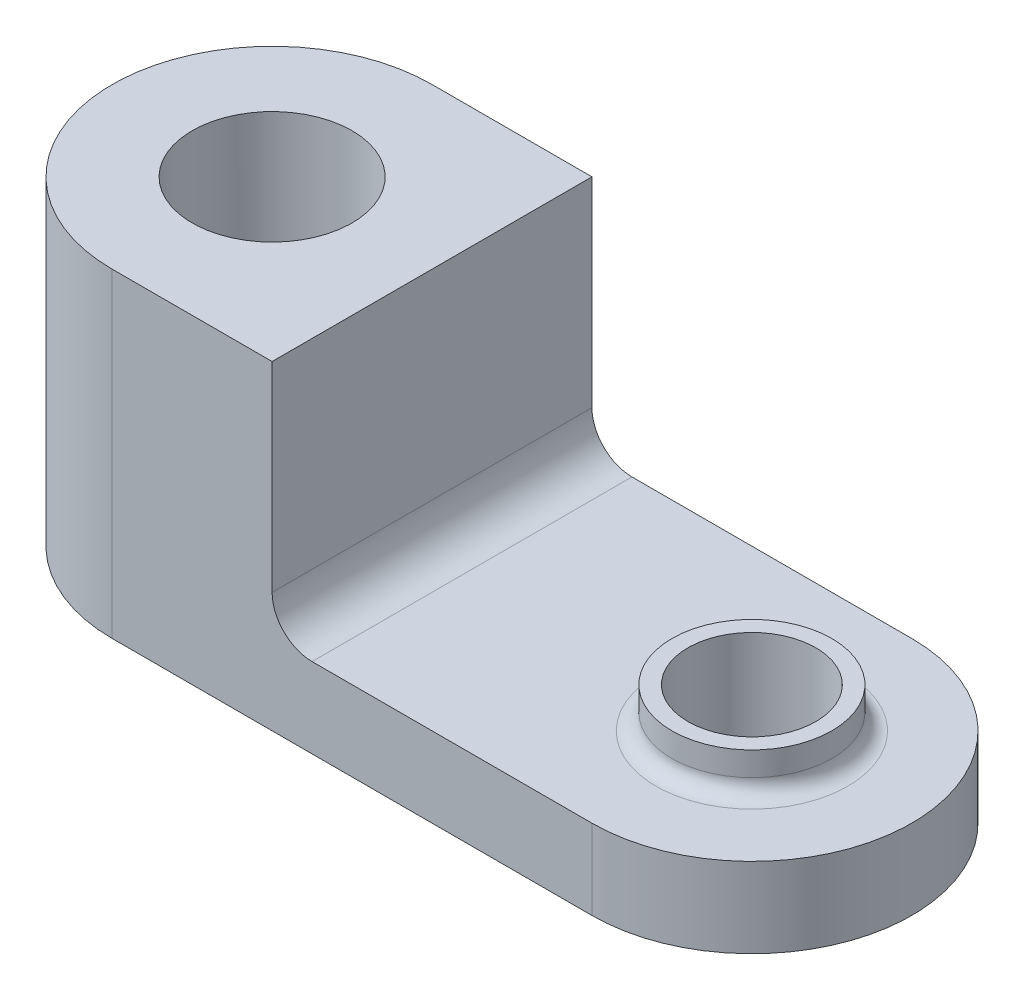
ISO-10303-21;
HEADER;
FILE_DESCRIPTION(('STEP AP214'),'2;1');
FILE_NAME('part.step','',(''),(''),'','','');
FILE_SCHEMA(('AUTOMOTIVE_DESIGN { 1 0 10303 214 1 1 1 1 }'));
ENDSEC;
DATA;
#1=APPLICATION_CONTEXT('core data for automotive mechanical design processes');
#2=APPLICATION_PROTOCOL_DEFINITION('international standard','automotive_design',2000,#1);
#3=PRODUCT_CONTEXT('',#1,'mechanical');
#4=PRODUCT('Part','Part','',(#3));
#5=PRODUCT_RELATED_PRODUCT_CATEGORY('part','',(#4));
#6=PRODUCT_DEFINITION_FORMATION('','',#4);
#7=PRODUCT_DEFINITION_CONTEXT('part definition',#1,'design');
#8=PRODUCT_DEFINITION('design','',#6,#7);
#9=PRODUCT_DEFINITION_SHAPE('','',#8);
#10=(LENGTH_UNIT() NAMED_UNIT(*) SI_UNIT(.MILLI.,.METRE.));
#11=(NAMED_UNIT(*) PLANE_ANGLE_UNIT() SI_UNIT($,.RADIAN.));
#12=(NAMED_UNIT(*) SI_UNIT($,.STERADIAN.) SOLID_ANGLE_UNIT());
#13=UNCERTAINTY_MEASURE_WITH_UNIT(LENGTH_MEASURE(1.E-05),#10,'distance_accuracy_value','');
#14=(GEOMETRIC_REPRESENTATION_CONTEXT(3) GLOBAL_UNCERTAINTY_ASSIGNED_CONTEXT((#13)) GLOBAL_UNIT_ASSIGNED_CONTEXT((#10,
#11,#12)) REPRESENTATION_CONTEXT('',''));
#15=CARTESIAN_POINT('',(0.,0.,0.));
#16=DIRECTION('',(0.,0.,1.));
#17=DIRECTION('',(1.,0.,0.));
#18=AXIS2_PLACEMENT_3D('',#15,#16,#17);
#19=CARTESIAN_POINT('',(80.,0.,0.));
#20=DIRECTION('',(0.,1.,0.));
#21=DIRECTION('',(0.,0.,1.));
#22=AXIS2_PLACEMENT_3D('',#19,#20,#21);
#23=CYLINDRICAL_SURFACE('',#22,20.);
#24=DIRECTION('',(0.,1.,0.));
#25=VECTOR('',#24,1.);
#26=CARTESIAN_POINT('',(80.,0.,20.));
#27=LINE('',#26,#25);
#28=CARTESIAN_POINT('',(80.,0.,20.));
#29=VERTEX_POINT('',#28);
#30=CARTESIAN_POINT('',(80.,10.,20.));
#31=VERTEX_POINT('',#30);
#32=EDGE_CURVE('E154',#29,#31,#27,.T.);
#33=ORIENTED_EDGE('',*,*,#32,.F.);
#34=CARTESIAN_POINT('',(80.,0.,0.));
#35=DIRECTION('',(0.,1.,0.));
#36=DIRECTION('',(-1.,0.,0.));
#37=AXIS2_PLACEMENT_3D('',#34,#35,#36);
#38=CIRCLE('',#37,20.);
#39=CARTESIAN_POINT('',(80.,0.,-20.));
#40=VERTEX_POINT('',#39);
#41=EDGE_CURVE('E160',#40,#29,#38,.F.);
#42=ORIENTED_EDGE('',*,*,#41,.F.);
#43=DIRECTION('',(0.,-1.,0.));
#44=VECTOR('',#43,1.);
#45=CARTESIAN_POINT('',(80.,0.,-20.));
#46=LINE('',#45,#44);
#47=CARTESIAN_POINT('',(80.,10.,-20.));
#48=VERTEX_POINT('',#47);
#49=EDGE_CURVE('E157',#48,#40,#46,.T.);
#50=ORIENTED_EDGE('',*,*,#49,.F.);
#51=CARTESIAN_POINT('',(80.,10.,0.));
#52=DIRECTION('',(0.,-1.,0.));
#53=DIRECTION('',(0.,0.,-1.));
#54=AXIS2_PLACEMENT_3D('',#51,#52,#53);
#55=CIRCLE('',#54,20.);
#56=EDGE_CURVE('E162',#31,#48,#55,.F.);
#57=ORIENTED_EDGE('',*,*,#56,.F.);
#58=EDGE_LOOP('',(#33,#42,#50,#57));
#59=FACE_BOUND('',#58,.T.);
#60=ADVANCED_FACE('F47',(#59),#23,.T.);
#61=CARTESIAN_POINT('',(20.,0.,0.));
#62=DIRECTION('',(0.,-1.,0.));
#63=DIRECTION('',(0.,0.,-1.));
#64=AXIS2_PLACEMENT_3D('',#61,#62,#63);
#65=CYLINDRICAL_SURFACE('',#64,20.);
#66=DIRECTION('',(0.,1.,0.));
#67=VECTOR('',#66,1.);
#68=CARTESIAN_POINT('',(20.,0.,-20.));
#69=LINE('',#68,#67);
#70=CARTESIAN_POINT('',(20.,0.,-20.));
#71=VERTEX_POINT('',#70);
#72=CARTESIAN_POINT('',(20.,40.,-20.));
#73=VERTEX_POINT('',#72);
#74=EDGE_CURVE('E129',#71,#73,#69,.T.);
#75=ORIENTED_EDGE('',*,*,#74,.F.);
#76=CARTESIAN_POINT('',(20.,0.,0.));
#77=DIRECTION('',(0.,1.,0.));
#78=DIRECTION('',(-1.,0.,0.));
#79=AXIS2_PLACEMENT_3D('',#76,#77,#78);
#80=CIRCLE('',#79,20.);
#81=CARTESIAN_POINT('',(20.,0.,20.));
#82=VERTEX_POINT('',#81);
#83=EDGE_CURVE('E151',#82,#71,#80,.F.);
#84=ORIENTED_EDGE('',*,*,#83,.F.);
#85=DIRECTION('',(0.,-1.,0.));
#86=VECTOR('',#85,1.);
#87=CARTESIAN_POINT('',(20.,0.,20.));
#88=LINE('',#87,#86);
#89=CARTESIAN_POINT('',(20.,40.,20.));
#90=VERTEX_POINT('',#89);
#91=EDGE_CURVE('E149',#90,#82,#88,.T.);
#92=ORIENTED_EDGE('',*,*,#91,.F.);
#93=CARTESIAN_POINT('',(20.,40.,0.));
#94=DIRECTION('',(0.,-1.,0.));
#95=DIRECTION('',(0.,0.,-1.));
#96=AXIS2_PLACEMENT_3D('',#93,#94,#95);
#97=CIRCLE('',#96,20.);
#98=EDGE_CURVE('E132',#73,#90,#97,.F.);
#99=ORIENTED_EDGE('',*,*,#98,.F.);
#100=EDGE_LOOP('',(#75,#84,#92,#99));
#101=FACE_BOUND('',#100,.T.);
#102=ADVANCED_FACE('F184',(#101),#65,.T.);
#103=CARTESIAN_POINT('',(100.,0.,20.));
#104=DIRECTION('',(0.,1.,0.));
#105=DIRECTION('',(-1.,0.,0.));
#106=AXIS2_PLACEMENT_3D('',#103,#104,#105);
#107=PLANE('',#106);
#108=CARTESIAN_POINT('',(20.,0.,0.));
#109=DIRECTION('',(0.,1.,0.));
#110=DIRECTION('',(0.,0.,1.));
#111=AXIS2_PLACEMENT_3D('',#108,#109,#110);
#112=CIRCLE('',#111,10.);
#113=CARTESIAN_POINT('',(20.,0.,10.));
#114=VERTEX_POINT('',#113);
#115=EDGE_CURVE('E141',#114,#114,#112,.T.);
#116=ORIENTED_EDGE('',*,*,#115,.T.);
#117=EDGE_LOOP('',(#116));
#118=FACE_BOUND('',#117,.T.);
#119=DIRECTION('',(1.,0.,0.));
#120=VECTOR('',#119,1.);
#121=CARTESIAN_POINT('',(100.,0.,-20.));
#122=LINE('',#121,#120);
#123=EDGE_CURVE('E137',#71,#40,#122,.T.);
#124=ORIENTED_EDGE('',*,*,#123,.T.);
#125=ORIENTED_EDGE('',*,*,#41,.T.);
#126=DIRECTION('',(1.,0.,0.));
#127=VECTOR('',#126,1.);
#128=CARTESIAN_POINT('',(100.,0.,20.));
#129=LINE('',#128,#127);
#130=EDGE_CURVE('E145',#82,#29,#129,.T.);
#131=ORIENTED_EDGE('',*,*,#130,.F.);
#132=ORIENTED_EDGE('',*,*,#83,.T.);
#133=EDGE_LOOP('',(#124,#125,#131,#132));
#134=FACE_BOUND('',#133,.T.);
#135=CARTESIAN_POINT('',(80.,0.,0.));
#136=DIRECTION('',(0.,1.,0.));
#137=DIRECTION('',(0.,0.,1.));
#138=AXIS2_PLACEMENT_3D('',#135,#136,#137);
#139=CIRCLE('',#138,8.);
#140=CARTESIAN_POINT('',(80.,0.,8.));
#141=VERTEX_POINT('',#140);
#142=EDGE_CURVE('E219',#141,#141,#139,.T.);
#143=ORIENTED_EDGE('',*,*,#142,.T.);
#144=EDGE_LOOP('',(#143));
#145=FACE_BOUND('',#144,.T.);
#146=ADVANCED_FACE('F190',(#118,#134,#145),#107,.F.);
#147=CARTESIAN_POINT('',(40.,10.,20.));
#148=DIRECTION('',(0.,-1.,0.));
#149=DIRECTION('',(0.,0.,-1.));
#150=AXIS2_PLACEMENT_3D('',#147,#148,#149);
#151=PLANE('',#150);
#152=CARTESIAN_POINT('',(80.,10.,0.));
#153=DIRECTION('',(0.,-1.,0.));
#154=DIRECTION('',(0.,0.,-1.));
#155=AXIS2_PLACEMENT_3D('',#152,#153,#154);
#156=CIRCLE('',#155,12.);
#157=CARTESIAN_POINT('',(80.,10.,-12.));
#158=VERTEX_POINT('',#157);
#159=EDGE_CURVE('E12',#158,#158,#156,.T.);
#160=ORIENTED_EDGE('',*,*,#159,.T.);
#161=EDGE_LOOP('',(#160));
#162=FACE_BOUND('',#161,.T.);
#163=DIRECTION('',(-1.,0.,0.));
#164=VECTOR('',#163,1.);
#165=CARTESIAN_POINT('',(40.,10.,-20.));
#166=LINE('',#165,#164);
#167=CARTESIAN_POINT('',(45.,10.,-20.));
#168=VERTEX_POINT('',#167);
#169=EDGE_CURVE('E140',#48,#168,#166,.T.);
#170=ORIENTED_EDGE('',*,*,#169,.T.);
#171=DIRECTION('',(0.,0.,-1.));
#172=VECTOR('',#171,1.);
#173=CARTESIAN_POINT('',(45.,10.,20.));
#174=LINE('',#173,#172);
#175=CARTESIAN_POINT('',(45.,10.,20.));
#176=VERTEX_POINT('',#175);
#177=EDGE_CURVE('E69',#168,#176,#174,.F.);
#178=ORIENTED_EDGE('',*,*,#177,.T.);
#179=DIRECTION('',(-1.,0.,0.));
#180=VECTOR('',#179,1.);
#181=CARTESIAN_POINT('',(40.,10.,20.));
#182=LINE('',#181,#180);
#183=EDGE_CURVE('E120',#31,#176,#182,.T.);
#184=ORIENTED_EDGE('',*,*,#183,.F.);
#185=ORIENTED_EDGE('',*,*,#56,.T.);
#186=EDGE_LOOP('',(#170,#178,#184,#185));
#187=FACE_BOUND('',#186,.T.);
#188=ADVANCED_FACE('F251',(#162,#187),#151,.F.);
#189=CARTESIAN_POINT('',(40.,40.,20.));
#190=DIRECTION('',(-1.,0.,0.));
#191=DIRECTION('',(0.,-1.,0.));
#192=AXIS2_PLACEMENT_3D('',#189,#190,#191);
#193=PLANE('',#192);
#194=DIRECTION('',(0.,1.,0.));
#195=VECTOR('',#194,1.);
#196=CARTESIAN_POINT('',(40.,40.,20.));
#197=LINE('',#196,#195);
#198=CARTESIAN_POINT('',(40.,15.,20.));
#199=VERTEX_POINT('',#198);
#200=CARTESIAN_POINT('',(40.,40.,20.));
#201=VERTEX_POINT('',#200);
#202=EDGE_CURVE('E108',#199,#201,#197,.T.);
#203=ORIENTED_EDGE('',*,*,#202,.F.);
#204=DIRECTION('',(0.,0.,-1.));
#205=VECTOR('',#204,1.);
#206=CARTESIAN_POINT('',(40.,15.,-20.));
#207=LINE('',#206,#205);
#208=CARTESIAN_POINT('',(40.,15.,-20.));
#209=VERTEX_POINT('',#208);
#210=EDGE_CURVE('E164',#199,#209,#207,.T.);
#211=ORIENTED_EDGE('',*,*,#210,.T.);
#212=DIRECTION('',(0.,1.,0.));
#213=VECTOR('',#212,1.);
#214=CARTESIAN_POINT('',(40.,40.,-20.));
#215=LINE('',#214,#213);
#216=CARTESIAN_POINT('',(40.,40.,-20.));
#217=VERTEX_POINT('',#216);
#218=EDGE_CURVE('E125',#209,#217,#215,.T.);
#219=ORIENTED_EDGE('',*,*,#218,.T.);
#220=DIRECTION('',(0.,0.,-1.));
#221=VECTOR('',#220,1.);
#222=CARTESIAN_POINT('',(40.,40.,20.));
#223=LINE('',#222,#221);
#224=EDGE_CURVE('E123',#201,#217,#223,.T.);
#225=ORIENTED_EDGE('',*,*,#224,.F.);
#226=EDGE_LOOP('',(#203,#211,#219,#225));
#227=FACE_BOUND('',#226,.T.);
#228=ADVANCED_FACE('F124',(#227),#193,.F.);
#229=CARTESIAN_POINT('',(0.,40.,20.));
#230=DIRECTION('',(0.,-1.,0.));
#231=DIRECTION('',(0.,0.,-1.));
#232=AXIS2_PLACEMENT_3D('',#229,#230,#231);
#233=PLANE('',#232);
#234=CARTESIAN_POINT('',(20.,40.,0.));
#235=DIRECTION('',(0.,-1.,0.));
#236=DIRECTION('',(0.,0.,-1.));
#237=AXIS2_PLACEMENT_3D('',#234,#235,#236);
#238=CIRCLE('',#237,10.);
#239=CARTESIAN_POINT('',(20.,40.,-10.));
#240=VERTEX_POINT('',#239);
#241=EDGE_CURVE('E222',#240,#240,#238,.T.);
#242=ORIENTED_EDGE('',*,*,#241,.T.);
#243=EDGE_LOOP('',(#242));
#244=FACE_BOUND('',#243,.T.);
#245=DIRECTION('',(-1.,0.,0.));
#246=VECTOR('',#245,1.);
#247=CARTESIAN_POINT('',(0.,40.,-20.));
#248=LINE('',#247,#246);
#249=EDGE_CURVE('E144',#217,#73,#248,.T.);
#250=ORIENTED_EDGE('',*,*,#249,.T.);
#251=ORIENTED_EDGE('',*,*,#98,.T.);
#252=DIRECTION('',(-1.,0.,0.));
#253=VECTOR('',#252,1.);
#254=CARTESIAN_POINT('',(0.,40.,20.));
#255=LINE('',#254,#253);
#256=EDGE_CURVE('E114',#201,#90,#255,.T.);
#257=ORIENTED_EDGE('',*,*,#256,.F.);
#258=ORIENTED_EDGE('',*,*,#224,.T.);
#259=EDGE_LOOP('',(#250,#251,#257,#258));
#260=FACE_BOUND('',#259,.T.);
#261=ADVANCED_FACE('F131',(#244,#260),#233,.F.);
#262=CARTESIAN_POINT('',(0.,0.,20.));
#263=DIRECTION('',(0.,0.,-1.));
#264=DIRECTION('',(-1.,0.,0.));
#265=AXIS2_PLACEMENT_3D('',#262,#263,#264);
#266=PLANE('',#265);
#267=ORIENTED_EDGE('',*,*,#130,.T.);
#268=ORIENTED_EDGE('',*,*,#32,.T.);
#269=ORIENTED_EDGE('',*,*,#183,.T.);
#270=CARTESIAN_POINT('',(45.,15.,20.));
#271=DIRECTION('',(0.,0.,-1.));
#272=DIRECTION('',(-1.,0.,0.));
#273=AXIS2_PLACEMENT_3D('',#270,#271,#272);
#274=CIRCLE('',#273,5.);
#275=EDGE_CURVE('E116',#176,#199,#274,.T.);
#276=ORIENTED_EDGE('',*,*,#275,.T.);
#277=ORIENTED_EDGE('',*,*,#202,.T.);
#278=ORIENTED_EDGE('',*,*,#256,.T.);
#279=ORIENTED_EDGE('',*,*,#91,.T.);
#280=EDGE_LOOP('',(#267,#268,#269,#276,#277,#278,#279));
#281=FACE_BOUND('',#280,.T.);
#282=ADVANCED_FACE('F111',(#281),#266,.F.);
#283=CARTESIAN_POINT('',(0.,0.,-20.));
#284=DIRECTION('',(0.,0.,-1.));
#285=DIRECTION('',(-1.,0.,0.));
#286=AXIS2_PLACEMENT_3D('',#283,#284,#285);
#287=PLANE('',#286);
#288=ORIENTED_EDGE('',*,*,#169,.F.);
#289=ORIENTED_EDGE('',*,*,#49,.T.);
#290=ORIENTED_EDGE('',*,*,#123,.F.);
#291=ORIENTED_EDGE('',*,*,#74,.T.);
#292=ORIENTED_EDGE('',*,*,#249,.F.);
#293=ORIENTED_EDGE('',*,*,#218,.F.);
#294=CARTESIAN_POINT('',(45.,15.,-20.));
#295=DIRECTION('',(0.,0.,-1.));
#296=DIRECTION('',(-1.,0.,0.));
#297=AXIS2_PLACEMENT_3D('',#294,#295,#296);
#298=CIRCLE('',#297,5.);
#299=EDGE_CURVE('E62',#209,#168,#298,.F.);
#300=ORIENTED_EDGE('',*,*,#299,.T.);
#301=EDGE_LOOP('',(#288,#289,#290,#291,#292,#293,#300));
#302=FACE_BOUND('',#301,.T.);
#303=ADVANCED_FACE('F202',(#302),#287,.T.);
#304=CARTESIAN_POINT('',(45.,15.,20.));
#305=DIRECTION('',(0.,0.,1.));
#306=DIRECTION('',(1.,0.,0.));
#307=AXIS2_PLACEMENT_3D('',#304,#305,#306);
#308=CYLINDRICAL_SURFACE('',#307,5.);
#309=ORIENTED_EDGE('',*,*,#275,.F.);
#310=ORIENTED_EDGE('',*,*,#177,.F.);
#311=ORIENTED_EDGE('',*,*,#299,.F.);
#312=ORIENTED_EDGE('',*,*,#210,.F.);
#313=EDGE_LOOP('',(#309,#310,#311,#312));
#314=FACE_BOUND('',#313,.T.);
#315=ADVANCED_FACE('F199',(#314),#308,.F.);
#316=CARTESIAN_POINT('',(20.,40.001,0.));
#317=DIRECTION('',(0.,-1.,0.));
#318=DIRECTION('',(0.,0.,-1.));
#319=AXIS2_PLACEMENT_3D('',#316,#317,#318);
#320=CYLINDRICAL_SURFACE('',#319,10.);
#321=ORIENTED_EDGE('',*,*,#115,.F.);
#322=EDGE_LOOP('',(#321));
#323=FACE_BOUND('',#322,.T.);
#324=ORIENTED_EDGE('',*,*,#241,.F.);
#325=EDGE_LOOP('',(#324));
#326=FACE_BOUND('',#325,.T.);
#327=ADVANCED_FACE('F201',(#323,#326),#320,.F.);
#328=CARTESIAN_POINT('',(80.,40.001,0.));
#329=DIRECTION('',(0.,-1.,0.));
#330=DIRECTION('',(0.,0.,-1.));
#331=AXIS2_PLACEMENT_3D('',#328,#329,#330);
#332=CYLINDRICAL_SURFACE('',#331,8.);
#333=ORIENTED_EDGE('',*,*,#142,.F.);
#334=EDGE_LOOP('',(#333));
#335=FACE_BOUND('',#334,.T.);
#336=CARTESIAN_POINT('',(80.,15.,0.));
#337=DIRECTION('',(0.,1.,0.));
#338=DIRECTION('',(0.,0.,1.));
#339=AXIS2_PLACEMENT_3D('',#336,#337,#338);
#340=CIRCLE('',#339,8.);
#341=CARTESIAN_POINT('',(80.,15.,8.));
#342=VERTEX_POINT('',#341);
#343=EDGE_CURVE('E230',#342,#342,#340,.T.);
#344=ORIENTED_EDGE('',*,*,#343,.T.);
#345=EDGE_LOOP('',(#344));
#346=FACE_BOUND('',#345,.T.);
#347=ADVANCED_FACE('F208',(#335,#346),#332,.F.);
#348=CARTESIAN_POINT('',(80.,15.,0.));
#349=DIRECTION('',(0.,-1.,0.));
#350=DIRECTION('',(0.,0.,-1.));
#351=AXIS2_PLACEMENT_3D('',#348,#349,#350);
#352=CYLINDRICAL_SURFACE('',#351,9.99999999999999);
#353=CARTESIAN_POINT('',(80.,12.,0.));
#354=DIRECTION('',(0.,-1.,0.));
#355=DIRECTION('',(0.,0.,-1.));
#356=AXIS2_PLACEMENT_3D('',#353,#354,#355);
#357=CIRCLE('',#356,9.99999999999999);
#358=CARTESIAN_POINT('',(80.,12.,-9.99999999999999));
#359=VERTEX_POINT('',#358);
#360=EDGE_CURVE('E55',#359,#359,#357,.F.);
#361=ORIENTED_EDGE('',*,*,#360,.T.);
#362=EDGE_LOOP('',(#361));
#363=FACE_BOUND('',#362,.T.);
#364=CARTESIAN_POINT('',(80.,15.,0.));
#365=DIRECTION('',(0.,1.,0.));
#366=DIRECTION('',(0.,0.,1.));
#367=AXIS2_PLACEMENT_3D('',#364,#365,#366);
#368=CIRCLE('',#367,9.99999999999999);
#369=CARTESIAN_POINT('',(80.,15.,9.99999999999999));
#370=VERTEX_POINT('',#369);
#371=EDGE_CURVE('E223',#370,#370,#368,.T.);
#372=ORIENTED_EDGE('',*,*,#371,.F.);
#373=EDGE_LOOP('',(#372));
#374=FACE_BOUND('',#373,.T.);
#375=ADVANCED_FACE('F171',(#363,#374),#352,.T.);
#376=CARTESIAN_POINT('',(0.,15.,0.));
#377=DIRECTION('',(0.,1.,0.));
#378=DIRECTION('',(0.,0.,1.));
#379=AXIS2_PLACEMENT_3D('',#376,#377,#378);
#380=PLANE('',#379);
#381=ORIENTED_EDGE('',*,*,#343,.F.);
#382=EDGE_LOOP('',(#381));
#383=FACE_BOUND('',#382,.T.);
#384=ORIENTED_EDGE('',*,*,#371,.T.);
#385=EDGE_LOOP('',(#384));
#386=FACE_BOUND('',#385,.T.);
#387=ADVANCED_FACE('F175',(#383,#386),#380,.T.);
#388=CARTESIAN_POINT('',(80.,12.,0.));
#389=DIRECTION('',(0.,-1.,0.));
#390=DIRECTION('',(0.,0.,-1.));
#391=AXIS2_PLACEMENT_3D('',#388,#389,#390);
#392=TOROIDAL_SURFACE('',#391,12.,2.);
#393=ORIENTED_EDGE('',*,*,#159,.F.);
#394=EDGE_LOOP('',(#393));
#395=FACE_BOUND('',#394,.T.);
#396=ORIENTED_EDGE('',*,*,#360,.F.);
#397=EDGE_LOOP('',(#396));
#398=FACE_BOUND('',#397,.T.);
#399=ADVANCED_FACE('F49',(#395,#398),#392,.F.);
#400=CLOSED_SHELL('',(#60,#102,#146,#188,#228,#261,#282,#303,#315,#327,#347,#375,#387,#399));
#401=MANIFOLD_SOLID_BREP('B2',#400);
#402=ADVANCED_BREP_SHAPE_REPRESENTATION('',(#18,#401),#14);
#403=SHAPE_DEFINITION_REPRESENTATION(#9,#402);
ENDSEC;
END-ISO-10303-21;
